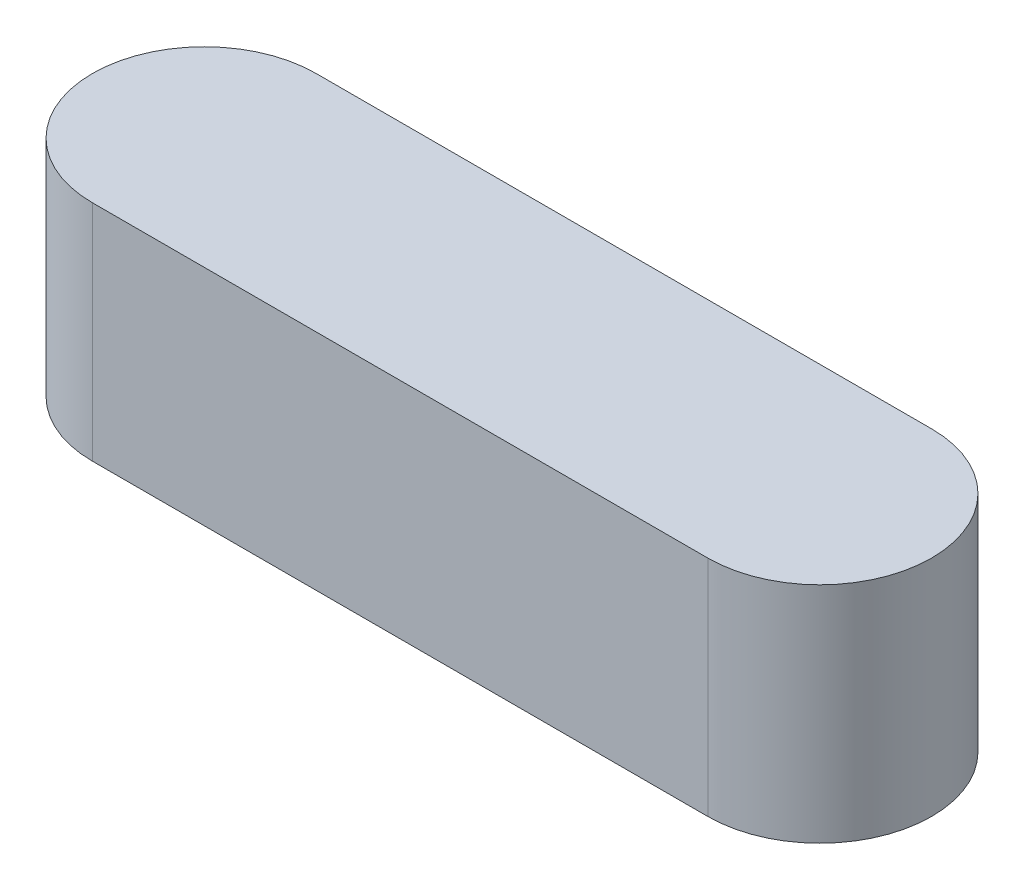
ISO-10303-21;
HEADER;
FILE_DESCRIPTION(('STEP AP214'),'2;1');
FILE_NAME('part.step','',(''),(''),'','','');
FILE_SCHEMA(('AUTOMOTIVE_DESIGN { 1 0 10303 214 1 1 1 1 }'));
ENDSEC;
DATA;
#1=APPLICATION_CONTEXT('core data for automotive mechanical design processes');
#2=APPLICATION_PROTOCOL_DEFINITION('international standard','automotive_design',2000,#1);
#3=PRODUCT_CONTEXT('',#1,'mechanical');
#4=PRODUCT('Part','Part','',(#3));
#5=PRODUCT_RELATED_PRODUCT_CATEGORY('part','',(#4));
#6=PRODUCT_DEFINITION_FORMATION('','',#4);
#7=PRODUCT_DEFINITION_CONTEXT('part definition',#1,'design');
#8=PRODUCT_DEFINITION('design','',#6,#7);
#9=PRODUCT_DEFINITION_SHAPE('','',#8);
#10=(LENGTH_UNIT() NAMED_UNIT(*) SI_UNIT(.MILLI.,.METRE.));
#11=(NAMED_UNIT(*) PLANE_ANGLE_UNIT() SI_UNIT($,.RADIAN.));
#12=(NAMED_UNIT(*) SI_UNIT($,.STERADIAN.) SOLID_ANGLE_UNIT());
#13=UNCERTAINTY_MEASURE_WITH_UNIT(LENGTH_MEASURE(1.E-05),#10,'distance_accuracy_value','');
#14=(GEOMETRIC_REPRESENTATION_CONTEXT(3) GLOBAL_UNCERTAINTY_ASSIGNED_CONTEXT((#13)) GLOBAL_UNIT_ASSIGNED_CONTEXT((#10,
#11,#12)) REPRESENTATION_CONTEXT('',''));
#15=CARTESIAN_POINT('',(0.,0.,0.));
#16=DIRECTION('',(0.,0.,1.));
#17=DIRECTION('',(1.,0.,0.));
#18=AXIS2_PLACEMENT_3D('',#15,#16,#17);
#19=CARTESIAN_POINT('',(-27.5,20.,0.));
#20=DIRECTION('',(0.,-1.,0.));
#21=DIRECTION('',(0.,0.,-1.));
#22=AXIS2_PLACEMENT_3D('',#19,#20,#21);
#23=CYLINDRICAL_SURFACE('',#22,10.);
#24=CARTESIAN_POINT('',(-27.5,0.,0.));
#25=DIRECTION('',(0.,1.,0.));
#26=DIRECTION('',(0.,0.,1.));
#27=AXIS2_PLACEMENT_3D('',#24,#25,#26);
#28=CIRCLE('',#27,10.);
#29=CARTESIAN_POINT('',(-27.5,0.,-10.));
#30=VERTEX_POINT('',#29);
#31=CARTESIAN_POINT('',(-27.5,0.,10.));
#32=VERTEX_POINT('',#31);
#33=EDGE_CURVE('E102',#30,#32,#28,.T.);
#34=ORIENTED_EDGE('',*,*,#33,.T.);
#35=DIRECTION('',(0.,-1.,0.));
#36=VECTOR('',#35,1.);
#37=CARTESIAN_POINT('',(-27.5,20.,10.));
#38=LINE('',#37,#36);
#39=CARTESIAN_POINT('',(-27.5,20.,10.));
#40=VERTEX_POINT('',#39);
#41=EDGE_CURVE('E11',#40,#32,#38,.T.);
#42=ORIENTED_EDGE('',*,*,#41,.F.);
#43=CARTESIAN_POINT('',(-27.5,20.,0.));
#44=DIRECTION('',(0.,1.,0.));
#45=DIRECTION('',(0.,0.,1.));
#46=AXIS2_PLACEMENT_3D('',#43,#44,#45);
#47=CIRCLE('',#46,10.);
#48=CARTESIAN_POINT('',(-27.5,20.,-10.));
#49=VERTEX_POINT('',#48);
#50=EDGE_CURVE('E90',#49,#40,#47,.T.);
#51=ORIENTED_EDGE('',*,*,#50,.F.);
#52=DIRECTION('',(0.,-1.,0.));
#53=VECTOR('',#52,1.);
#54=CARTESIAN_POINT('',(-27.5,20.,-10.));
#55=LINE('',#54,#53);
#56=EDGE_CURVE('E98',#49,#30,#55,.T.);
#57=ORIENTED_EDGE('',*,*,#56,.T.);
#58=EDGE_LOOP('',(#34,#42,#51,#57));
#59=FACE_BOUND('',#58,.T.);
#60=ADVANCED_FACE('F39',(#59),#23,.T.);
#61=CARTESIAN_POINT('',(-27.5,20.,10.));
#62=DIRECTION('',(0.,0.,-1.));
#63=DIRECTION('',(-1.,0.,0.));
#64=AXIS2_PLACEMENT_3D('',#61,#62,#63);
#65=PLANE('',#64);
#66=DIRECTION('',(1.,0.,0.));
#67=VECTOR('',#66,1.);
#68=CARTESIAN_POINT('',(-27.5,0.,10.));
#69=LINE('',#68,#67);
#70=CARTESIAN_POINT('',(27.5,0.,9.99999999999999));
#71=VERTEX_POINT('',#70);
#72=EDGE_CURVE('E94',#32,#71,#69,.T.);
#73=ORIENTED_EDGE('',*,*,#72,.T.);
#74=DIRECTION('',(0.,-1.,0.));
#75=VECTOR('',#74,1.);
#76=CARTESIAN_POINT('',(27.5,20.,9.99999999999999));
#77=LINE('',#76,#75);
#78=CARTESIAN_POINT('',(27.5,20.,9.99999999999999));
#79=VERTEX_POINT('',#78);
#80=EDGE_CURVE('E47',#79,#71,#77,.T.);
#81=ORIENTED_EDGE('',*,*,#80,.F.);
#82=DIRECTION('',(1.,0.,0.));
#83=VECTOR('',#82,1.);
#84=CARTESIAN_POINT('',(-27.5,20.,10.));
#85=LINE('',#84,#83);
#86=EDGE_CURVE('E85',#40,#79,#85,.T.);
#87=ORIENTED_EDGE('',*,*,#86,.F.);
#88=ORIENTED_EDGE('',*,*,#41,.T.);
#89=EDGE_LOOP('',(#73,#81,#87,#88));
#90=FACE_BOUND('',#89,.T.);
#91=ADVANCED_FACE('F93',(#90),#65,.F.);
#92=CARTESIAN_POINT('',(27.5,20.,0.));
#93=DIRECTION('',(0.,-1.,0.));
#94=DIRECTION('',(0.,0.,-1.));
#95=AXIS2_PLACEMENT_3D('',#92,#93,#94);
#96=CYLINDRICAL_SURFACE('',#95,10.);
#97=CARTESIAN_POINT('',(27.5,0.,0.));
#98=DIRECTION('',(0.,1.,0.));
#99=DIRECTION('',(0.,0.,1.));
#100=AXIS2_PLACEMENT_3D('',#97,#98,#99);
#101=CIRCLE('',#100,10.);
#102=CARTESIAN_POINT('',(27.5,0.,-10.));
#103=VERTEX_POINT('',#102);
#104=EDGE_CURVE('E72',#71,#103,#101,.T.);
#105=ORIENTED_EDGE('',*,*,#104,.T.);
#106=DIRECTION('',(0.,-1.,0.));
#107=VECTOR('',#106,1.);
#108=CARTESIAN_POINT('',(27.5,20.,-10.));
#109=LINE('',#108,#107);
#110=CARTESIAN_POINT('',(27.5,20.,-10.));
#111=VERTEX_POINT('',#110);
#112=EDGE_CURVE('E95',#111,#103,#109,.T.);
#113=ORIENTED_EDGE('',*,*,#112,.F.);
#114=CARTESIAN_POINT('',(27.5,20.,0.));
#115=DIRECTION('',(0.,1.,0.));
#116=DIRECTION('',(0.,0.,1.));
#117=AXIS2_PLACEMENT_3D('',#114,#115,#116);
#118=CIRCLE('',#117,10.);
#119=EDGE_CURVE('E88',#79,#111,#118,.T.);
#120=ORIENTED_EDGE('',*,*,#119,.F.);
#121=ORIENTED_EDGE('',*,*,#80,.T.);
#122=EDGE_LOOP('',(#105,#113,#120,#121));
#123=FACE_BOUND('',#122,.T.);
#124=ADVANCED_FACE('F96',(#123),#96,.T.);
#125=CARTESIAN_POINT('',(-27.5,20.,-10.));
#126=DIRECTION('',(0.,0.,1.));
#127=DIRECTION('',(1.,0.,0.));
#128=AXIS2_PLACEMENT_3D('',#125,#126,#127);
#129=PLANE('',#128);
#130=DIRECTION('',(-1.,0.,0.));
#131=VECTOR('',#130,1.);
#132=CARTESIAN_POINT('',(-27.5,0.,-10.));
#133=LINE('',#132,#131);
#134=EDGE_CURVE('E78',#103,#30,#133,.T.);
#135=ORIENTED_EDGE('',*,*,#134,.T.);
#136=ORIENTED_EDGE('',*,*,#56,.F.);
#137=DIRECTION('',(-1.,0.,0.));
#138=VECTOR('',#137,1.);
#139=CARTESIAN_POINT('',(-27.5,20.,-10.));
#140=LINE('',#139,#138);
#141=EDGE_CURVE('E55',#111,#49,#140,.T.);
#142=ORIENTED_EDGE('',*,*,#141,.F.);
#143=ORIENTED_EDGE('',*,*,#112,.T.);
#144=EDGE_LOOP('',(#135,#136,#142,#143));
#145=FACE_BOUND('',#144,.T.);
#146=ADVANCED_FACE('F109',(#145),#129,.F.);
#147=CARTESIAN_POINT('',(-27.5,20.,0.));
#148=DIRECTION('',(0.,1.,0.));
#149=DIRECTION('',(0.,0.,1.));
#150=AXIS2_PLACEMENT_3D('',#147,#148,#149);
#151=PLANE('',#150);
#152=ORIENTED_EDGE('',*,*,#50,.T.);
#153=ORIENTED_EDGE('',*,*,#86,.T.);
#154=ORIENTED_EDGE('',*,*,#119,.T.);
#155=ORIENTED_EDGE('',*,*,#141,.T.);
#156=EDGE_LOOP('',(#152,#153,#154,#155));
#157=FACE_BOUND('',#156,.T.);
#158=ADVANCED_FACE('F86',(#157),#151,.T.);
#159=CARTESIAN_POINT('',(-27.5,0.,0.));
#160=DIRECTION('',(0.,1.,0.));
#161=DIRECTION('',(0.,0.,1.));
#162=AXIS2_PLACEMENT_3D('',#159,#160,#161);
#163=PLANE('',#162);
#164=ORIENTED_EDGE('',*,*,#33,.F.);
#165=ORIENTED_EDGE('',*,*,#134,.F.);
#166=ORIENTED_EDGE('',*,*,#104,.F.);
#167=ORIENTED_EDGE('',*,*,#72,.F.);
#168=EDGE_LOOP('',(#164,#165,#166,#167));
#169=FACE_BOUND('',#168,.T.);
#170=ADVANCED_FACE('F112',(#169),#163,.F.);
#171=CLOSED_SHELL('',(#60,#91,#124,#146,#158,#170));
#172=MANIFOLD_SOLID_BREP('B2',#171);
#173=ADVANCED_BREP_SHAPE_REPRESENTATION('',(#18,#172),#14);
#174=SHAPE_DEFINITION_REPRESENTATION(#9,#173);
ENDSEC;
END-ISO-10303-21;
